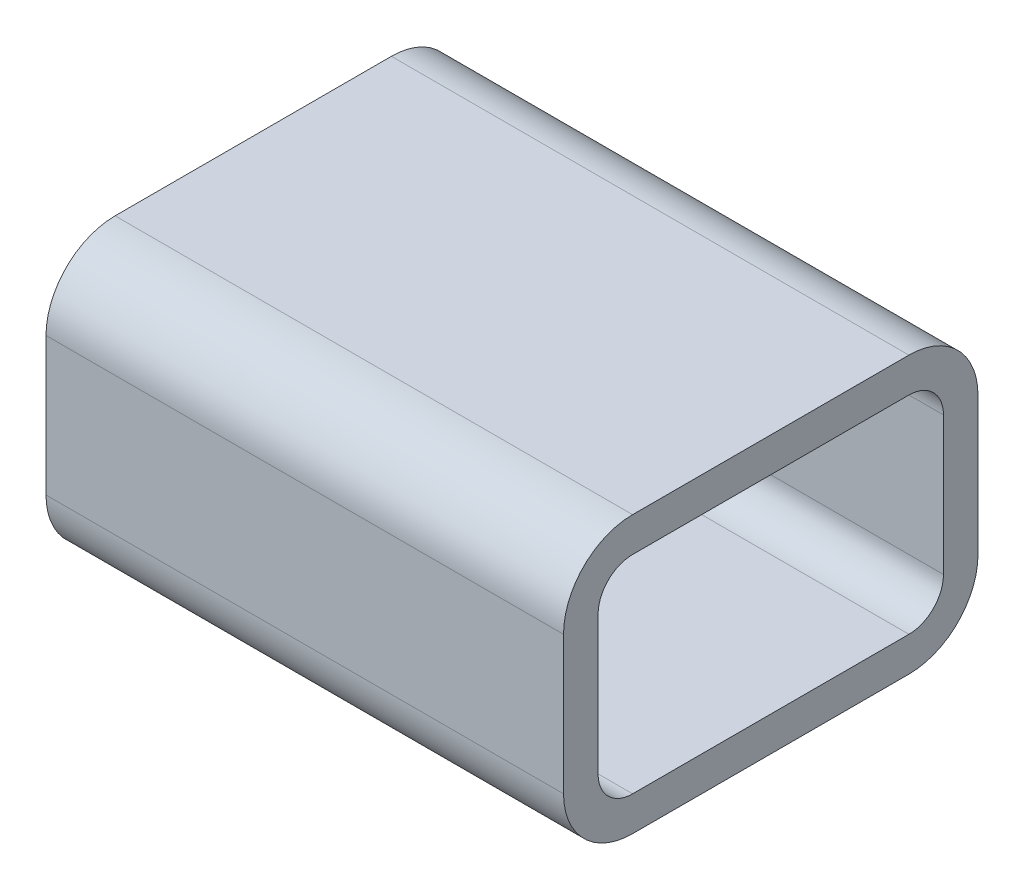
ISO-10303-21;
HEADER;
FILE_DESCRIPTION(('STEP AP214'),'2;1');
FILE_NAME('part.step','',(''),(''),'','','');
FILE_SCHEMA(('AUTOMOTIVE_DESIGN { 1 0 10303 214 1 1 1 1 }'));
ENDSEC;
DATA;
#1=APPLICATION_CONTEXT('core data for automotive mechanical design processes');
#2=APPLICATION_PROTOCOL_DEFINITION('international standard','automotive_design',2000,#1);
#3=PRODUCT_CONTEXT('',#1,'mechanical');
#4=PRODUCT('Part','Part','',(#3));
#5=PRODUCT_RELATED_PRODUCT_CATEGORY('part','',(#4));
#6=PRODUCT_DEFINITION_FORMATION('','',#4);
#7=PRODUCT_DEFINITION_CONTEXT('part definition',#1,'design');
#8=PRODUCT_DEFINITION('design','',#6,#7);
#9=PRODUCT_DEFINITION_SHAPE('','',#8);
#10=(LENGTH_UNIT() NAMED_UNIT(*) SI_UNIT(.MILLI.,.METRE.));
#11=(NAMED_UNIT(*) PLANE_ANGLE_UNIT() SI_UNIT($,.RADIAN.));
#12=(NAMED_UNIT(*) SI_UNIT($,.STERADIAN.) SOLID_ANGLE_UNIT());
#13=UNCERTAINTY_MEASURE_WITH_UNIT(LENGTH_MEASURE(1.E-05),#10,'distance_accuracy_value','');
#14=(GEOMETRIC_REPRESENTATION_CONTEXT(3) GLOBAL_UNCERTAINTY_ASSIGNED_CONTEXT((#13)) GLOBAL_UNIT_ASSIGNED_CONTEXT((#10,
#11,#12)) REPRESENTATION_CONTEXT('',''));
#15=CARTESIAN_POINT('',(0.,0.,0.));
#16=DIRECTION('',(0.,0.,1.));
#17=DIRECTION('',(1.,0.,0.));
#18=AXIS2_PLACEMENT_3D('',#15,#16,#17);
#19=CARTESIAN_POINT('',(95.1475800115076,12.699978029,25.4));
#20=DIRECTION('',(-1.,0.,0.));
#21=DIRECTION('',(0.,0.,1.));
#22=AXIS2_PLACEMENT_3D('',#19,#20,#21);
#23=CYLINDRICAL_SURFACE('',#22,12.7);
#24=CARTESIAN_POINT('',(0.,12.699978029,25.4));
#25=DIRECTION('',(1.,0.,0.));
#26=DIRECTION('',(0.,0.,-1.));
#27=AXIS2_PLACEMENT_3D('',#24,#25,#26);
#28=CIRCLE('',#27,12.7);
#29=CARTESIAN_POINT('',(0.,25.399978029,25.4));
#30=VERTEX_POINT('',#29);
#31=CARTESIAN_POINT('',(0.,12.699978029,38.1));
#32=VERTEX_POINT('',#31);
#33=EDGE_CURVE('E239',#30,#32,#28,.T.);
#34=ORIENTED_EDGE('',*,*,#33,.T.);
#35=DIRECTION('',(-1.,0.,0.));
#36=VECTOR('',#35,1.);
#37=CARTESIAN_POINT('',(95.1475800115076,12.699978029,38.1));
#38=LINE('',#37,#36);
#39=CARTESIAN_POINT('',(95.1475800115076,12.699978029,38.1));
#40=VERTEX_POINT('',#39);
#41=EDGE_CURVE('E12',#40,#32,#38,.T.);
#42=ORIENTED_EDGE('',*,*,#41,.F.);
#43=CARTESIAN_POINT('',(95.1475800115076,12.699978029,25.4));
#44=DIRECTION('',(1.,0.,0.));
#45=DIRECTION('',(0.,0.,-1.));
#46=AXIS2_PLACEMENT_3D('',#43,#44,#45);
#47=CIRCLE('',#46,12.7);
#48=CARTESIAN_POINT('',(95.1475800115076,25.399978029,25.4));
#49=VERTEX_POINT('',#48);
#50=EDGE_CURVE('E317',#49,#40,#47,.T.);
#51=ORIENTED_EDGE('',*,*,#50,.F.);
#52=DIRECTION('',(-1.,0.,0.));
#53=VECTOR('',#52,1.);
#54=CARTESIAN_POINT('',(95.1475800115076,25.399978029,25.4));
#55=LINE('',#54,#53);
#56=EDGE_CURVE('E254',#49,#30,#55,.T.);
#57=ORIENTED_EDGE('',*,*,#56,.T.);
#58=EDGE_LOOP('',(#34,#42,#51,#57));
#59=FACE_BOUND('',#58,.T.);
#60=ADVANCED_FACE('F67',(#59),#23,.T.);
#61=CARTESIAN_POINT('',(95.1475800115076,12.699978029,38.1));
#62=DIRECTION('',(0.,0.,-1.));
#63=DIRECTION('',(-1.,0.,0.));
#64=AXIS2_PLACEMENT_3D('',#61,#62,#63);
#65=PLANE('',#64);
#66=DIRECTION('',(0.,-1.,0.));
#67=VECTOR('',#66,1.);
#68=CARTESIAN_POINT('',(0.,12.699978029,38.1));
#69=LINE('',#68,#67);
#70=CARTESIAN_POINT('',(0.,-12.699978029,38.1));
#71=VERTEX_POINT('',#70);
#72=EDGE_CURVE('E242',#32,#71,#69,.T.);
#73=ORIENTED_EDGE('',*,*,#72,.T.);
#74=DIRECTION('',(-1.,0.,0.));
#75=VECTOR('',#74,1.);
#76=CARTESIAN_POINT('',(95.1475800115076,-12.699978029,38.1));
#77=LINE('',#76,#75);
#78=CARTESIAN_POINT('',(95.1475800115076,-12.699978029,38.1));
#79=VERTEX_POINT('',#78);
#80=EDGE_CURVE('E77',#79,#71,#77,.T.);
#81=ORIENTED_EDGE('',*,*,#80,.F.);
#82=DIRECTION('',(0.,-1.,0.));
#83=VECTOR('',#82,1.);
#84=CARTESIAN_POINT('',(95.1475800115076,12.699978029,38.1));
#85=LINE('',#84,#83);
#86=EDGE_CURVE('E319',#40,#79,#85,.T.);
#87=ORIENTED_EDGE('',*,*,#86,.F.);
#88=ORIENTED_EDGE('',*,*,#41,.T.);
#89=EDGE_LOOP('',(#73,#81,#87,#88));
#90=FACE_BOUND('',#89,.T.);
#91=ADVANCED_FACE('F354',(#90),#65,.F.);
#92=CARTESIAN_POINT('',(95.1475800115076,-12.699978029,25.4));
#93=DIRECTION('',(-1.,0.,0.));
#94=DIRECTION('',(0.,0.,1.));
#95=AXIS2_PLACEMENT_3D('',#92,#93,#94);
#96=CYLINDRICAL_SURFACE('',#95,12.7);
#97=CARTESIAN_POINT('',(0.,-12.699978029,25.4));
#98=DIRECTION('',(1.,0.,0.));
#99=DIRECTION('',(0.,0.,-1.));
#100=AXIS2_PLACEMENT_3D('',#97,#98,#99);
#101=CIRCLE('',#100,12.7);
#102=CARTESIAN_POINT('',(0.,-25.399978029,25.4));
#103=VERTEX_POINT('',#102);
#104=EDGE_CURVE('E244',#71,#103,#101,.T.);
#105=ORIENTED_EDGE('',*,*,#104,.T.);
#106=DIRECTION('',(-1.,0.,0.));
#107=VECTOR('',#106,1.);
#108=CARTESIAN_POINT('',(95.1475800115076,-25.399978029,25.4));
#109=LINE('',#108,#107);
#110=CARTESIAN_POINT('',(95.1475800115076,-25.399978029,25.4));
#111=VERTEX_POINT('',#110);
#112=EDGE_CURVE('E261',#111,#103,#109,.T.);
#113=ORIENTED_EDGE('',*,*,#112,.F.);
#114=CARTESIAN_POINT('',(95.1475800115076,-12.699978029,25.4));
#115=DIRECTION('',(1.,0.,0.));
#116=DIRECTION('',(0.,0.,-1.));
#117=AXIS2_PLACEMENT_3D('',#114,#115,#116);
#118=CIRCLE('',#117,12.7);
#119=EDGE_CURVE('E321',#79,#111,#118,.T.);
#120=ORIENTED_EDGE('',*,*,#119,.F.);
#121=ORIENTED_EDGE('',*,*,#80,.T.);
#122=EDGE_LOOP('',(#105,#113,#120,#121));
#123=FACE_BOUND('',#122,.T.);
#124=ADVANCED_FACE('F359',(#123),#96,.T.);
#125=CARTESIAN_POINT('',(95.1475800115076,-25.399978029,-25.4));
#126=DIRECTION('',(0.,1.,0.));
#127=DIRECTION('',(0.,0.,1.));
#128=AXIS2_PLACEMENT_3D('',#125,#126,#127);
#129=PLANE('',#128);
#130=DIRECTION('',(0.,0.,-1.));
#131=VECTOR('',#130,1.);
#132=CARTESIAN_POINT('',(0.,-25.399978029,-25.4));
#133=LINE('',#132,#131);
#134=CARTESIAN_POINT('',(0.,-25.399978029,-25.4));
#135=VERTEX_POINT('',#134);
#136=EDGE_CURVE('E246',#103,#135,#133,.T.);
#137=ORIENTED_EDGE('',*,*,#136,.T.);
#138=DIRECTION('',(-1.,0.,0.));
#139=VECTOR('',#138,1.);
#140=CARTESIAN_POINT('',(95.1475800115076,-25.399978029,-25.4));
#141=LINE('',#140,#139);
#142=CARTESIAN_POINT('',(95.1475800115076,-25.399978029,-25.4));
#143=VERTEX_POINT('',#142);
#144=EDGE_CURVE('E258',#143,#135,#141,.T.);
#145=ORIENTED_EDGE('',*,*,#144,.F.);
#146=DIRECTION('',(0.,0.,-1.));
#147=VECTOR('',#146,1.);
#148=CARTESIAN_POINT('',(95.1475800115076,-25.399978029,-25.4));
#149=LINE('',#148,#147);
#150=EDGE_CURVE('E323',#111,#143,#149,.T.);
#151=ORIENTED_EDGE('',*,*,#150,.F.);
#152=ORIENTED_EDGE('',*,*,#112,.T.);
#153=EDGE_LOOP('',(#137,#145,#151,#152));
#154=FACE_BOUND('',#153,.T.);
#155=ADVANCED_FACE('F329',(#154),#129,.F.);
#156=CARTESIAN_POINT('',(95.1475800115076,-12.699978029,-25.4));
#157=DIRECTION('',(-1.,0.,0.));
#158=DIRECTION('',(0.,0.,1.));
#159=AXIS2_PLACEMENT_3D('',#156,#157,#158);
#160=CYLINDRICAL_SURFACE('',#159,12.7);
#161=CARTESIAN_POINT('',(0.,-12.699978029,-25.4));
#162=DIRECTION('',(1.,0.,0.));
#163=DIRECTION('',(0.,0.,-1.));
#164=AXIS2_PLACEMENT_3D('',#161,#162,#163);
#165=CIRCLE('',#164,12.7);
#166=CARTESIAN_POINT('',(0.,-12.699978029,-38.1));
#167=VERTEX_POINT('',#166);
#168=EDGE_CURVE('E248',#135,#167,#165,.T.);
#169=ORIENTED_EDGE('',*,*,#168,.T.);
#170=DIRECTION('',(-1.,0.,0.));
#171=VECTOR('',#170,1.);
#172=CARTESIAN_POINT('',(95.1475800115076,-12.699978029,-38.1));
#173=LINE('',#172,#171);
#174=CARTESIAN_POINT('',(95.1475800115076,-12.699978029,-38.1));
#175=VERTEX_POINT('',#174);
#176=EDGE_CURVE('E206',#175,#167,#173,.T.);
#177=ORIENTED_EDGE('',*,*,#176,.F.);
#178=CARTESIAN_POINT('',(95.1475800115076,-12.699978029,-25.4));
#179=DIRECTION('',(1.,0.,0.));
#180=DIRECTION('',(0.,0.,-1.));
#181=AXIS2_PLACEMENT_3D('',#178,#179,#180);
#182=CIRCLE('',#181,12.7);
#183=EDGE_CURVE('E197',#143,#175,#182,.T.);
#184=ORIENTED_EDGE('',*,*,#183,.F.);
#185=ORIENTED_EDGE('',*,*,#144,.T.);
#186=EDGE_LOOP('',(#169,#177,#184,#185));
#187=FACE_BOUND('',#186,.T.);
#188=ADVANCED_FACE('F333',(#187),#160,.T.);
#189=CARTESIAN_POINT('',(95.1475800115076,-12.699978029,-38.1));
#190=DIRECTION('',(0.,0.,1.));
#191=DIRECTION('',(1.,0.,0.));
#192=AXIS2_PLACEMENT_3D('',#189,#190,#191);
#193=PLANE('',#192);
#194=DIRECTION('',(0.,1.,0.));
#195=VECTOR('',#194,1.);
#196=CARTESIAN_POINT('',(0.,-12.699978029,-38.1));
#197=LINE('',#196,#195);
#198=CARTESIAN_POINT('',(0.,12.699978029,-38.1));
#199=VERTEX_POINT('',#198);
#200=EDGE_CURVE('E205',#167,#199,#197,.T.);
#201=ORIENTED_EDGE('',*,*,#200,.T.);
#202=DIRECTION('',(-1.,0.,0.));
#203=VECTOR('',#202,1.);
#204=CARTESIAN_POINT('',(95.1475800115076,12.699978029,-38.1));
#205=LINE('',#204,#203);
#206=CARTESIAN_POINT('',(95.1475800115076,12.699978029,-38.1));
#207=VERTEX_POINT('',#206);
#208=EDGE_CURVE('E202',#207,#199,#205,.T.);
#209=ORIENTED_EDGE('',*,*,#208,.F.);
#210=DIRECTION('',(0.,1.,0.));
#211=VECTOR('',#210,1.);
#212=CARTESIAN_POINT('',(95.1475800115076,-12.699978029,-38.1));
#213=LINE('',#212,#211);
#214=EDGE_CURVE('E191',#175,#207,#213,.T.);
#215=ORIENTED_EDGE('',*,*,#214,.F.);
#216=ORIENTED_EDGE('',*,*,#176,.T.);
#217=EDGE_LOOP('',(#201,#209,#215,#216));
#218=FACE_BOUND('',#217,.T.);
#219=ADVANCED_FACE('F203',(#218),#193,.F.);
#220=CARTESIAN_POINT('',(95.1475800115076,12.699978029,-25.4));
#221=DIRECTION('',(-1.,0.,0.));
#222=DIRECTION('',(0.,0.,1.));
#223=AXIS2_PLACEMENT_3D('',#220,#221,#222);
#224=CYLINDRICAL_SURFACE('',#223,12.7);
#225=CARTESIAN_POINT('',(0.,12.699978029,-25.4));
#226=DIRECTION('',(1.,0.,0.));
#227=DIRECTION('',(0.,0.,-1.));
#228=AXIS2_PLACEMENT_3D('',#225,#226,#227);
#229=CIRCLE('',#228,12.7);
#230=CARTESIAN_POINT('',(0.,25.399978029,-25.4));
#231=VERTEX_POINT('',#230);
#232=EDGE_CURVE('E139',#199,#231,#229,.T.);
#233=ORIENTED_EDGE('',*,*,#232,.T.);
#234=DIRECTION('',(-1.,0.,0.));
#235=VECTOR('',#234,1.);
#236=CARTESIAN_POINT('',(95.1475800115076,25.399978029,-25.4));
#237=LINE('',#236,#235);
#238=CARTESIAN_POINT('',(95.1475800115076,25.399978029,-25.4));
#239=VERTEX_POINT('',#238);
#240=EDGE_CURVE('E207',#239,#231,#237,.T.);
#241=ORIENTED_EDGE('',*,*,#240,.F.);
#242=CARTESIAN_POINT('',(95.1475800115076,12.699978029,-25.4));
#243=DIRECTION('',(1.,0.,0.));
#244=DIRECTION('',(0.,0.,-1.));
#245=AXIS2_PLACEMENT_3D('',#242,#243,#244);
#246=CIRCLE('',#245,12.7);
#247=EDGE_CURVE('E195',#207,#239,#246,.T.);
#248=ORIENTED_EDGE('',*,*,#247,.F.);
#249=ORIENTED_EDGE('',*,*,#208,.T.);
#250=EDGE_LOOP('',(#233,#241,#248,#249));
#251=FACE_BOUND('',#250,.T.);
#252=ADVANCED_FACE('F209',(#251),#224,.T.);
#253=CARTESIAN_POINT('',(95.1475800115076,-12.699978029,25.4));
#254=DIRECTION('',(-1.,0.,0.));
#255=DIRECTION('',(0.,0.,1.));
#256=AXIS2_PLACEMENT_3D('',#253,#254,#255);
#257=CYLINDRICAL_SURFACE('',#256,6.35);
#258=CARTESIAN_POINT('',(0.,-12.699978029,25.4));
#259=DIRECTION('',(1.,0.,0.));
#260=DIRECTION('',(0.,0.,-1.));
#261=AXIS2_PLACEMENT_3D('',#258,#259,#260);
#262=CIRCLE('',#261,6.35);
#263=CARTESIAN_POINT('',(0.,-12.699978029,31.75));
#264=VERTEX_POINT('',#263);
#265=CARTESIAN_POINT('',(0.,-19.049978029,25.4));
#266=VERTEX_POINT('',#265);
#267=EDGE_CURVE('E215',#264,#266,#262,.T.);
#268=ORIENTED_EDGE('',*,*,#267,.F.);
#269=DIRECTION('',(-1.,0.,0.));
#270=VECTOR('',#269,1.);
#271=CARTESIAN_POINT('',(95.1475800115076,-12.699978029,31.75));
#272=LINE('',#271,#270);
#273=CARTESIAN_POINT('',(95.1475800115076,-12.699978029,31.75));
#274=VERTEX_POINT('',#273);
#275=EDGE_CURVE('E71',#274,#264,#272,.T.);
#276=ORIENTED_EDGE('',*,*,#275,.F.);
#277=CARTESIAN_POINT('',(95.1475800115076,-12.699978029,25.4));
#278=DIRECTION('',(1.,0.,0.));
#279=DIRECTION('',(0.,0.,-1.));
#280=AXIS2_PLACEMENT_3D('',#277,#278,#279);
#281=CIRCLE('',#280,6.35);
#282=CARTESIAN_POINT('',(95.1475800115076,-19.049978029,25.4));
#283=VERTEX_POINT('',#282);
#284=EDGE_CURVE('E253',#274,#283,#281,.T.);
#285=ORIENTED_EDGE('',*,*,#284,.T.);
#286=DIRECTION('',(-1.,0.,0.));
#287=VECTOR('',#286,1.);
#288=CARTESIAN_POINT('',(95.1475800115076,-19.049978029,25.4));
#289=LINE('',#288,#287);
#290=EDGE_CURVE('E211',#283,#266,#289,.T.);
#291=ORIENTED_EDGE('',*,*,#290,.T.);
#292=EDGE_LOOP('',(#268,#276,#285,#291));
#293=FACE_BOUND('',#292,.T.);
#294=ADVANCED_FACE('F69',(#293),#257,.F.);
#295=CARTESIAN_POINT('',(95.1475800115076,12.699978029,31.75));
#296=DIRECTION('',(0.,0.,-1.));
#297=DIRECTION('',(-1.,0.,0.));
#298=AXIS2_PLACEMENT_3D('',#295,#296,#297);
#299=PLANE('',#298);
#300=DIRECTION('',(0.,-1.,0.));
#301=VECTOR('',#300,1.);
#302=CARTESIAN_POINT('',(0.,12.699978029,31.75));
#303=LINE('',#302,#301);
#304=CARTESIAN_POINT('',(0.,12.699978029,31.75));
#305=VERTEX_POINT('',#304);
#306=EDGE_CURVE('E218',#305,#264,#303,.T.);
#307=ORIENTED_EDGE('',*,*,#306,.F.);
#308=DIRECTION('',(-1.,0.,0.));
#309=VECTOR('',#308,1.);
#310=CARTESIAN_POINT('',(95.1475800115076,12.699978029,31.75));
#311=LINE('',#310,#309);
#312=CARTESIAN_POINT('',(95.1475800115076,12.699978029,31.75));
#313=VERTEX_POINT('',#312);
#314=EDGE_CURVE('E276',#313,#305,#311,.T.);
#315=ORIENTED_EDGE('',*,*,#314,.F.);
#316=DIRECTION('',(0.,-1.,0.));
#317=VECTOR('',#316,1.);
#318=CARTESIAN_POINT('',(95.1475800115076,12.699978029,31.75));
#319=LINE('',#318,#317);
#320=EDGE_CURVE('E285',#313,#274,#319,.T.);
#321=ORIENTED_EDGE('',*,*,#320,.T.);
#322=ORIENTED_EDGE('',*,*,#275,.T.);
#323=EDGE_LOOP('',(#307,#315,#321,#322));
#324=FACE_BOUND('',#323,.T.);
#325=ADVANCED_FACE('F283',(#324),#299,.T.);
#326=CARTESIAN_POINT('',(95.1475800115076,12.699978029,25.4));
#327=DIRECTION('',(-1.,0.,0.));
#328=DIRECTION('',(0.,0.,1.));
#329=AXIS2_PLACEMENT_3D('',#326,#327,#328);
#330=CYLINDRICAL_SURFACE('',#329,6.35);
#331=CARTESIAN_POINT('',(0.,12.699978029,25.4));
#332=DIRECTION('',(1.,0.,0.));
#333=DIRECTION('',(0.,0.,-1.));
#334=AXIS2_PLACEMENT_3D('',#331,#332,#333);
#335=CIRCLE('',#334,6.35);
#336=CARTESIAN_POINT('',(0.,19.049978029,25.4));
#337=VERTEX_POINT('',#336);
#338=EDGE_CURVE('E221',#337,#305,#335,.T.);
#339=ORIENTED_EDGE('',*,*,#338,.F.);
#340=DIRECTION('',(-1.,0.,0.));
#341=VECTOR('',#340,1.);
#342=CARTESIAN_POINT('',(95.1475800115076,19.049978029,25.4));
#343=LINE('',#342,#341);
#344=CARTESIAN_POINT('',(95.1475800115076,19.049978029,25.4));
#345=VERTEX_POINT('',#344);
#346=EDGE_CURVE('E275',#345,#337,#343,.T.);
#347=ORIENTED_EDGE('',*,*,#346,.F.);
#348=CARTESIAN_POINT('',(95.1475800115076,12.699978029,25.4));
#349=DIRECTION('',(1.,0.,0.));
#350=DIRECTION('',(0.,0.,-1.));
#351=AXIS2_PLACEMENT_3D('',#348,#349,#350);
#352=CIRCLE('',#351,6.35);
#353=EDGE_CURVE('E293',#345,#313,#352,.T.);
#354=ORIENTED_EDGE('',*,*,#353,.T.);
#355=ORIENTED_EDGE('',*,*,#314,.T.);
#356=EDGE_LOOP('',(#339,#347,#354,#355));
#357=FACE_BOUND('',#356,.T.);
#358=ADVANCED_FACE('F291',(#357),#330,.F.);
#359=CARTESIAN_POINT('',(95.1475800115076,19.049978029,25.4));
#360=DIRECTION('',(0.,-1.,0.));
#361=DIRECTION('',(0.,0.,-1.));
#362=AXIS2_PLACEMENT_3D('',#359,#360,#361);
#363=PLANE('',#362);
#364=DIRECTION('',(0.,0.,1.));
#365=VECTOR('',#364,1.);
#366=CARTESIAN_POINT('',(0.,19.049978029,25.4));
#367=LINE('',#366,#365);
#368=CARTESIAN_POINT('',(0.,19.049978029,-25.4));
#369=VERTEX_POINT('',#368);
#370=EDGE_CURVE('E224',#369,#337,#367,.T.);
#371=ORIENTED_EDGE('',*,*,#370,.F.);
#372=DIRECTION('',(-1.,0.,0.));
#373=VECTOR('',#372,1.);
#374=CARTESIAN_POINT('',(95.1475800115076,19.049978029,-25.4));
#375=LINE('',#374,#373);
#376=CARTESIAN_POINT('',(95.1475800115076,19.049978029,-25.4));
#377=VERTEX_POINT('',#376);
#378=EDGE_CURVE('E273',#377,#369,#375,.T.);
#379=ORIENTED_EDGE('',*,*,#378,.F.);
#380=DIRECTION('',(0.,0.,1.));
#381=VECTOR('',#380,1.);
#382=CARTESIAN_POINT('',(95.1475800115076,19.049978029,25.4));
#383=LINE('',#382,#381);
#384=EDGE_CURVE('E299',#377,#345,#383,.T.);
#385=ORIENTED_EDGE('',*,*,#384,.T.);
#386=ORIENTED_EDGE('',*,*,#346,.T.);
#387=EDGE_LOOP('',(#371,#379,#385,#386));
#388=FACE_BOUND('',#387,.T.);
#389=ADVANCED_FACE('F302',(#388),#363,.T.);
#390=CARTESIAN_POINT('',(95.1475800115076,12.699978029,-25.4));
#391=DIRECTION('',(-1.,0.,0.));
#392=DIRECTION('',(0.,0.,1.));
#393=AXIS2_PLACEMENT_3D('',#390,#391,#392);
#394=CYLINDRICAL_SURFACE('',#393,6.35);
#395=CARTESIAN_POINT('',(0.,12.699978029,-25.4));
#396=DIRECTION('',(1.,0.,0.));
#397=DIRECTION('',(0.,0.,-1.));
#398=AXIS2_PLACEMENT_3D('',#395,#396,#397);
#399=CIRCLE('',#398,6.35);
#400=CARTESIAN_POINT('',(0.,12.699978029,-31.75));
#401=VERTEX_POINT('',#400);
#402=EDGE_CURVE('E227',#401,#369,#399,.T.);
#403=ORIENTED_EDGE('',*,*,#402,.F.);
#404=DIRECTION('',(-1.,0.,0.));
#405=VECTOR('',#404,1.);
#406=CARTESIAN_POINT('',(95.1475800115076,12.699978029,-31.75));
#407=LINE('',#406,#405);
#408=CARTESIAN_POINT('',(95.1475800115076,12.699978029,-31.75));
#409=VERTEX_POINT('',#408);
#410=EDGE_CURVE('E271',#409,#401,#407,.T.);
#411=ORIENTED_EDGE('',*,*,#410,.F.);
#412=CARTESIAN_POINT('',(95.1475800115076,12.699978029,-25.4));
#413=DIRECTION('',(1.,0.,0.));
#414=DIRECTION('',(0.,0.,-1.));
#415=AXIS2_PLACEMENT_3D('',#412,#413,#414);
#416=CIRCLE('',#415,6.35);
#417=EDGE_CURVE('E303',#409,#377,#416,.T.);
#418=ORIENTED_EDGE('',*,*,#417,.T.);
#419=ORIENTED_EDGE('',*,*,#378,.T.);
#420=EDGE_LOOP('',(#403,#411,#418,#419));
#421=FACE_BOUND('',#420,.T.);
#422=ADVANCED_FACE('F370',(#421),#394,.F.);
#423=CARTESIAN_POINT('',(95.1475800115076,-12.699978029,-31.75));
#424=DIRECTION('',(0.,0.,1.));
#425=DIRECTION('',(1.,0.,0.));
#426=AXIS2_PLACEMENT_3D('',#423,#424,#425);
#427=PLANE('',#426);
#428=DIRECTION('',(0.,1.,0.));
#429=VECTOR('',#428,1.);
#430=CARTESIAN_POINT('',(0.,-12.699978029,-31.75));
#431=LINE('',#430,#429);
#432=CARTESIAN_POINT('',(0.,-12.699978029,-31.75));
#433=VERTEX_POINT('',#432);
#434=EDGE_CURVE('E230',#433,#401,#431,.T.);
#435=ORIENTED_EDGE('',*,*,#434,.F.);
#436=DIRECTION('',(-1.,0.,0.));
#437=VECTOR('',#436,1.);
#438=CARTESIAN_POINT('',(95.1475800115076,-12.699978029,-31.75));
#439=LINE('',#438,#437);
#440=CARTESIAN_POINT('',(95.1475800115076,-12.699978029,-31.75));
#441=VERTEX_POINT('',#440);
#442=EDGE_CURVE('E269',#441,#433,#439,.T.);
#443=ORIENTED_EDGE('',*,*,#442,.F.);
#444=DIRECTION('',(0.,1.,0.));
#445=VECTOR('',#444,1.);
#446=CARTESIAN_POINT('',(95.1475800115076,-12.699978029,-31.75));
#447=LINE('',#446,#445);
#448=EDGE_CURVE('E305',#441,#409,#447,.T.);
#449=ORIENTED_EDGE('',*,*,#448,.T.);
#450=ORIENTED_EDGE('',*,*,#410,.T.);
#451=EDGE_LOOP('',(#435,#443,#449,#450));
#452=FACE_BOUND('',#451,.T.);
#453=ADVANCED_FACE('F366',(#452),#427,.T.);
#454=CARTESIAN_POINT('',(95.1475800115076,-12.699978029,-25.4));
#455=DIRECTION('',(-1.,0.,0.));
#456=DIRECTION('',(0.,0.,1.));
#457=AXIS2_PLACEMENT_3D('',#454,#455,#456);
#458=CYLINDRICAL_SURFACE('',#457,6.35);
#459=CARTESIAN_POINT('',(0.,-12.699978029,-25.4));
#460=DIRECTION('',(1.,0.,0.));
#461=DIRECTION('',(0.,0.,-1.));
#462=AXIS2_PLACEMENT_3D('',#459,#460,#461);
#463=CIRCLE('',#462,6.35);
#464=CARTESIAN_POINT('',(0.,-19.049978029,-25.4));
#465=VERTEX_POINT('',#464);
#466=EDGE_CURVE('E233',#465,#433,#463,.T.);
#467=ORIENTED_EDGE('',*,*,#466,.F.);
#468=DIRECTION('',(-1.,0.,0.));
#469=VECTOR('',#468,1.);
#470=CARTESIAN_POINT('',(95.1475800115076,-19.049978029,-25.4));
#471=LINE('',#470,#469);
#472=CARTESIAN_POINT('',(95.1475800115076,-19.049978029,-25.4));
#473=VERTEX_POINT('',#472);
#474=EDGE_CURVE('E267',#473,#465,#471,.T.);
#475=ORIENTED_EDGE('',*,*,#474,.F.);
#476=CARTESIAN_POINT('',(95.1475800115076,-12.699978029,-25.4));
#477=DIRECTION('',(1.,0.,0.));
#478=DIRECTION('',(0.,0.,-1.));
#479=AXIS2_PLACEMENT_3D('',#476,#477,#478);
#480=CIRCLE('',#479,6.35);
#481=EDGE_CURVE('E311',#473,#441,#480,.T.);
#482=ORIENTED_EDGE('',*,*,#481,.T.);
#483=ORIENTED_EDGE('',*,*,#442,.T.);
#484=EDGE_LOOP('',(#467,#475,#482,#483));
#485=FACE_BOUND('',#484,.T.);
#486=ADVANCED_FACE('F348',(#485),#458,.F.);
#487=CARTESIAN_POINT('',(95.1475800115076,-19.049978029,-25.4));
#488=DIRECTION('',(0.,1.,0.));
#489=DIRECTION('',(0.,0.,1.));
#490=AXIS2_PLACEMENT_3D('',#487,#488,#489);
#491=PLANE('',#490);
#492=DIRECTION('',(0.,0.,-1.));
#493=VECTOR('',#492,1.);
#494=CARTESIAN_POINT('',(0.,-19.049978029,-25.4));
#495=LINE('',#494,#493);
#496=EDGE_CURVE('E236',#266,#465,#495,.T.);
#497=ORIENTED_EDGE('',*,*,#496,.F.);
#498=ORIENTED_EDGE('',*,*,#290,.F.);
#499=DIRECTION('',(0.,0.,-1.));
#500=VECTOR('',#499,1.);
#501=CARTESIAN_POINT('',(95.1475800115076,-19.049978029,-25.4));
#502=LINE('',#501,#500);
#503=EDGE_CURVE('E314',#283,#473,#502,.T.);
#504=ORIENTED_EDGE('',*,*,#503,.T.);
#505=ORIENTED_EDGE('',*,*,#474,.T.);
#506=EDGE_LOOP('',(#497,#498,#504,#505));
#507=FACE_BOUND('',#506,.T.);
#508=ADVANCED_FACE('F341',(#507),#491,.T.);
#509=CARTESIAN_POINT('',(95.1475800115076,25.399978029,25.4));
#510=DIRECTION('',(0.,-1.,0.));
#511=DIRECTION('',(0.,0.,-1.));
#512=AXIS2_PLACEMENT_3D('',#509,#510,#511);
#513=PLANE('',#512);
#514=DIRECTION('',(0.,0.,1.));
#515=VECTOR('',#514,1.);
#516=CARTESIAN_POINT('',(0.,25.399978029,25.4));
#517=LINE('',#516,#515);
#518=EDGE_CURVE('E145',#231,#30,#517,.T.);
#519=ORIENTED_EDGE('',*,*,#518,.T.);
#520=ORIENTED_EDGE('',*,*,#56,.F.);
#521=DIRECTION('',(0.,0.,1.));
#522=VECTOR('',#521,1.);
#523=CARTESIAN_POINT('',(95.1475800115076,25.399978029,25.4));
#524=LINE('',#523,#522);
#525=EDGE_CURVE('E86',#239,#49,#524,.T.);
#526=ORIENTED_EDGE('',*,*,#525,.F.);
#527=ORIENTED_EDGE('',*,*,#240,.T.);
#528=EDGE_LOOP('',(#519,#520,#526,#527));
#529=FACE_BOUND('',#528,.T.);
#530=ADVANCED_FACE('F339',(#529),#513,.F.);
#531=CARTESIAN_POINT('',(95.1475800115076,12.699978029,25.4));
#532=DIRECTION('',(1.,0.,0.));
#533=DIRECTION('',(0.,0.,-1.));
#534=AXIS2_PLACEMENT_3D('',#531,#532,#533);
#535=PLANE('',#534);
#536=ORIENTED_EDGE('',*,*,#284,.F.);
#537=ORIENTED_EDGE('',*,*,#320,.F.);
#538=ORIENTED_EDGE('',*,*,#353,.F.);
#539=ORIENTED_EDGE('',*,*,#384,.F.);
#540=ORIENTED_EDGE('',*,*,#417,.F.);
#541=ORIENTED_EDGE('',*,*,#448,.F.);
#542=ORIENTED_EDGE('',*,*,#481,.F.);
#543=ORIENTED_EDGE('',*,*,#503,.F.);
#544=EDGE_LOOP('',(#536,#537,#538,#539,#540,#541,#542,#543));
#545=FACE_BOUND('',#544,.T.);
#546=ORIENTED_EDGE('',*,*,#50,.T.);
#547=ORIENTED_EDGE('',*,*,#86,.T.);
#548=ORIENTED_EDGE('',*,*,#119,.T.);
#549=ORIENTED_EDGE('',*,*,#150,.T.);
#550=ORIENTED_EDGE('',*,*,#183,.T.);
#551=ORIENTED_EDGE('',*,*,#214,.T.);
#552=ORIENTED_EDGE('',*,*,#247,.T.);
#553=ORIENTED_EDGE('',*,*,#525,.T.);
#554=EDGE_LOOP('',(#546,#547,#548,#549,#550,#551,#552,#553));
#555=FACE_BOUND('',#554,.T.);
#556=ADVANCED_FACE('F193',(#545,#555),#535,.T.);
#557=CARTESIAN_POINT('',(0.,12.699978029,25.4));
#558=DIRECTION('',(1.,0.,0.));
#559=DIRECTION('',(0.,0.,-1.));
#560=AXIS2_PLACEMENT_3D('',#557,#558,#559);
#561=PLANE('',#560);
#562=ORIENTED_EDGE('',*,*,#267,.T.);
#563=ORIENTED_EDGE('',*,*,#496,.T.);
#564=ORIENTED_EDGE('',*,*,#466,.T.);
#565=ORIENTED_EDGE('',*,*,#434,.T.);
#566=ORIENTED_EDGE('',*,*,#402,.T.);
#567=ORIENTED_EDGE('',*,*,#370,.T.);
#568=ORIENTED_EDGE('',*,*,#338,.T.);
#569=ORIENTED_EDGE('',*,*,#306,.T.);
#570=EDGE_LOOP('',(#562,#563,#564,#565,#566,#567,#568,#569));
#571=FACE_BOUND('',#570,.T.);
#572=ORIENTED_EDGE('',*,*,#33,.F.);
#573=ORIENTED_EDGE('',*,*,#518,.F.);
#574=ORIENTED_EDGE('',*,*,#232,.F.);
#575=ORIENTED_EDGE('',*,*,#200,.F.);
#576=ORIENTED_EDGE('',*,*,#168,.F.);
#577=ORIENTED_EDGE('',*,*,#136,.F.);
#578=ORIENTED_EDGE('',*,*,#104,.F.);
#579=ORIENTED_EDGE('',*,*,#72,.F.);
#580=EDGE_LOOP('',(#572,#573,#574,#575,#576,#577,#578,#579));
#581=FACE_BOUND('',#580,.T.);
#582=ADVANCED_FACE('F288',(#571,#581),#561,.F.);
#583=CLOSED_SHELL('',(#60,#91,#124,#155,#188,#219,#252,#294,#325,#358,#389,#422,#453,#486,#508,
#530,#556,#582));
#584=MANIFOLD_SOLID_BREP('B2',#583);
#585=ADVANCED_BREP_SHAPE_REPRESENTATION('',(#18,#584),#14);
#586=SHAPE_DEFINITION_REPRESENTATION(#9,#585);
ENDSEC;
END-ISO-10303-21;
